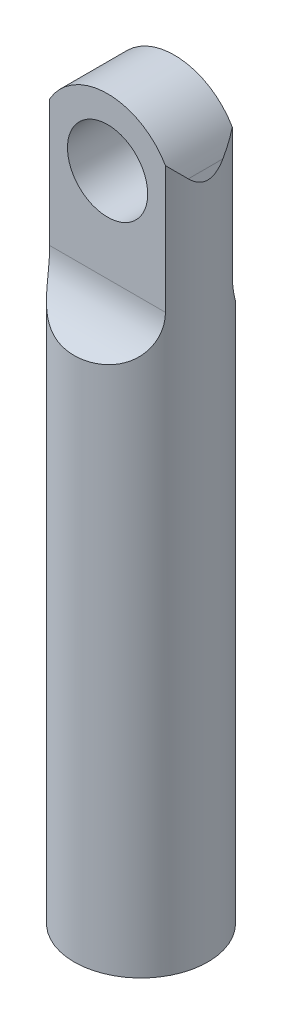
ISO-10303-21;
HEADER;
FILE_DESCRIPTION(('STEP AP214'),'2;1');
FILE_NAME('part.step','',(''),(''),'','','');
FILE_SCHEMA(('AUTOMOTIVE_DESIGN { 1 0 10303 214 1 1 1 1 }'));
ENDSEC;
DATA;
#1=APPLICATION_CONTEXT('core data for automotive mechanical design processes');
#2=APPLICATION_PROTOCOL_DEFINITION('international standard','automotive_design',2000,#1);
#3=PRODUCT_CONTEXT('',#1,'mechanical');
#4=PRODUCT('Part','Part','',(#3));
#5=PRODUCT_RELATED_PRODUCT_CATEGORY('part','',(#4));
#6=PRODUCT_DEFINITION_FORMATION('','',#4);
#7=PRODUCT_DEFINITION_CONTEXT('part definition',#1,'design');
#8=PRODUCT_DEFINITION('design','',#6,#7);
#9=PRODUCT_DEFINITION_SHAPE('','',#8);
#10=(LENGTH_UNIT() NAMED_UNIT(*) SI_UNIT(.MILLI.,.METRE.));
#11=(NAMED_UNIT(*) PLANE_ANGLE_UNIT() SI_UNIT($,.RADIAN.));
#12=(NAMED_UNIT(*) SI_UNIT($,.STERADIAN.) SOLID_ANGLE_UNIT());
#13=UNCERTAINTY_MEASURE_WITH_UNIT(LENGTH_MEASURE(1.E-05),#10,'distance_accuracy_value','');
#14=(GEOMETRIC_REPRESENTATION_CONTEXT(3) GLOBAL_UNCERTAINTY_ASSIGNED_CONTEXT((#13)) GLOBAL_UNIT_ASSIGNED_CONTEXT((#10,
#11,#12)) REPRESENTATION_CONTEXT('',''));
#15=CARTESIAN_POINT('',(0.,0.,0.));
#16=DIRECTION('',(0.,0.,1.));
#17=DIRECTION('',(1.,0.,0.));
#18=AXIS2_PLACEMENT_3D('',#15,#16,#17);
#19=CARTESIAN_POINT('',(-5.,55.,-2.5));
#20=DIRECTION('',(0.,0.,1.));
#21=DIRECTION('',(0.,-1.,0.));
#22=AXIS2_PLACEMENT_3D('',#19,#20,#21);
#23=PLANE('',#22);
#24=CARTESIAN_POINT('',(0.,50.,-2.5));
#25=DIRECTION('',(0.,0.,1.));
#26=DIRECTION('',(0.,-1.,0.));
#27=AXIS2_PLACEMENT_3D('',#24,#25,#26);
#28=CIRCLE('',#27,3.);
#29=CARTESIAN_POINT('',(0.,47.,-2.5));
#30=VERTEX_POINT('',#29);
#31=EDGE_CURVE('E170',#30,#30,#28,.T.);
#32=ORIENTED_EDGE('',*,*,#31,.T.);
#33=EDGE_LOOP('',(#32));
#34=FACE_BOUND('',#33,.T.);
#35=DIRECTION('',(0.,-1.,0.));
#36=VECTOR('',#35,1.);
#37=CARTESIAN_POINT('',(-4.33012701892219,55.,-2.5));
#38=LINE('',#37,#36);
#39=CARTESIAN_POINT('',(-4.33012701892219,52.5,-2.50000000000001));
#40=VERTEX_POINT('',#39);
#41=CARTESIAN_POINT('',(-4.33012701892219,43.,-2.5));
#42=VERTEX_POINT('',#41);
#43=EDGE_CURVE('E182',#40,#42,#38,.T.);
#44=ORIENTED_EDGE('',*,*,#43,.F.);
#45=CARTESIAN_POINT('',(0.,50.,-2.50000000000001));
#46=DIRECTION('',(0.,0.,1.));
#47=DIRECTION('',(0.,1.,0.));
#48=AXIS2_PLACEMENT_3D('',#45,#46,#47);
#49=CIRCLE('',#48,5.);
#50=CARTESIAN_POINT('',(4.33012701892219,52.5,-2.50000000000001));
#51=VERTEX_POINT('',#50);
#52=EDGE_CURVE('E148',#51,#40,#49,.T.);
#53=ORIENTED_EDGE('',*,*,#52,.F.);
#54=DIRECTION('',(0.,-1.,0.));
#55=VECTOR('',#54,1.);
#56=CARTESIAN_POINT('',(4.33012701892219,55.,-2.5));
#57=LINE('',#56,#55);
#58=CARTESIAN_POINT('',(4.33012701892219,43.,-2.5));
#59=VERTEX_POINT('',#58);
#60=EDGE_CURVE('E177',#59,#51,#57,.F.);
#61=ORIENTED_EDGE('',*,*,#60,.F.);
#62=DIRECTION('',(1.,0.,0.));
#63=VECTOR('',#62,1.);
#64=CARTESIAN_POINT('',(-5.,43.,-2.5));
#65=LINE('',#64,#63);
#66=EDGE_CURVE('E173',#42,#59,#65,.T.);
#67=ORIENTED_EDGE('',*,*,#66,.F.);
#68=EDGE_LOOP('',(#44,#53,#61,#67));
#69=FACE_BOUND('',#68,.T.);
#70=ADVANCED_FACE('F33',(#34,#69),#23,.F.);
#71=CARTESIAN_POINT('',(-5.,55.,2.5));
#72=DIRECTION('',(0.,0.,-1.));
#73=DIRECTION('',(0.,1.,0.));
#74=AXIS2_PLACEMENT_3D('',#71,#72,#73);
#75=PLANE('',#74);
#76=CARTESIAN_POINT('',(0.,50.,2.5));
#77=DIRECTION('',(0.,0.,1.));
#78=DIRECTION('',(1.,0.,0.));
#79=AXIS2_PLACEMENT_3D('',#76,#77,#78);
#80=CIRCLE('',#79,3.);
#81=CARTESIAN_POINT('',(3.,50.,2.5));
#82=VERTEX_POINT('',#81);
#83=EDGE_CURVE('E167',#82,#82,#80,.T.);
#84=ORIENTED_EDGE('',*,*,#83,.F.);
#85=EDGE_LOOP('',(#84));
#86=FACE_BOUND('',#85,.T.);
#87=CARTESIAN_POINT('',(0.,50.,2.5));
#88=DIRECTION('',(0.,0.,-1.));
#89=DIRECTION('',(0.,1.,0.));
#90=AXIS2_PLACEMENT_3D('',#87,#88,#89);
#91=CIRCLE('',#90,5.);
#92=CARTESIAN_POINT('',(4.33012701892219,52.5,2.5));
#93=VERTEX_POINT('',#92);
#94=CARTESIAN_POINT('',(-4.33012701892219,52.5,2.5));
#95=VERTEX_POINT('',#94);
#96=EDGE_CURVE('E238',#93,#95,#91,.F.);
#97=ORIENTED_EDGE('',*,*,#96,.T.);
#98=DIRECTION('',(0.,-1.,0.));
#99=VECTOR('',#98,1.);
#100=CARTESIAN_POINT('',(-4.33012701892219,55.,2.5));
#101=LINE('',#100,#99);
#102=CARTESIAN_POINT('',(-4.33012701892219,43.,2.5));
#103=VERTEX_POINT('',#102);
#104=EDGE_CURVE('E184',#103,#95,#101,.F.);
#105=ORIENTED_EDGE('',*,*,#104,.F.);
#106=DIRECTION('',(1.,0.,0.));
#107=VECTOR('',#106,1.);
#108=CARTESIAN_POINT('',(-5.,43.,2.5));
#109=LINE('',#108,#107);
#110=CARTESIAN_POINT('',(4.33012701892219,43.,2.5));
#111=VERTEX_POINT('',#110);
#112=EDGE_CURVE('E174',#103,#111,#109,.T.);
#113=ORIENTED_EDGE('',*,*,#112,.T.);
#114=DIRECTION('',(0.,-1.,0.));
#115=VECTOR('',#114,1.);
#116=CARTESIAN_POINT('',(4.33012701892219,55.,2.5));
#117=LINE('',#116,#115);
#118=EDGE_CURVE('E57',#93,#111,#117,.T.);
#119=ORIENTED_EDGE('',*,*,#118,.F.);
#120=EDGE_LOOP('',(#97,#105,#113,#119));
#121=FACE_BOUND('',#120,.T.);
#122=ADVANCED_FACE('F214',(#86,#121),#75,.F.);
#123=CARTESIAN_POINT('',(0.,55.,0.));
#124=DIRECTION('',(0.,-1.,0.));
#125=DIRECTION('',(0.,0.,-1.));
#126=AXIS2_PLACEMENT_3D('',#123,#124,#125);
#127=CYLINDRICAL_SURFACE('',#126,5.);
#128=ORIENTED_EDGE('',*,*,#60,.T.);
#129=CARTESIAN_POINT('',(0.,50.,0.));
#130=DIRECTION('',(0.,-0.707106781186547,-0.707106781186547));
#131=DIRECTION('',(0.,-0.707106781186548,0.707106781186547));
#132=AXIS2_PLACEMENT_3D('',#129,#130,#131);
#133=ELLIPSE('',#132,7.07106781186547,5.);
#134=CARTESIAN_POINT('',(4.82962913144534,51.2940952255126,-1.29409522551259));
#135=VERTEX_POINT('',#134);
#136=EDGE_CURVE('E163',#51,#135,#133,.T.);
#137=ORIENTED_EDGE('',*,*,#136,.T.);
#138=CARTESIAN_POINT('',(0.,69.3185165257816,0.));
#139=DIRECTION('',(-0.965925826289069,-0.258819045102518,0.));
#140=DIRECTION('',(0.258819045102518,-0.965925826289069,0.));
#141=AXIS2_PLACEMENT_3D('',#138,#139,#140);
#142=ELLIPSE('',#141,19.3185165257816,5.);
#143=CARTESIAN_POINT('',(4.82962913144534,51.2940952255126,1.29409522551259));
#144=VERTEX_POINT('',#143);
#145=EDGE_CURVE('E11',#135,#144,#142,.T.);
#146=ORIENTED_EDGE('',*,*,#145,.T.);
#147=CARTESIAN_POINT('',(0.,50.,0.));
#148=DIRECTION('',(0.,-0.707106781186548,0.707106781186547));
#149=DIRECTION('',(0.,-0.707106781186547,-0.707106781186547));
#150=AXIS2_PLACEMENT_3D('',#147,#148,#149);
#151=ELLIPSE('',#150,7.07106781186547,5.);
#152=EDGE_CURVE('E162',#144,#93,#151,.T.);
#153=ORIENTED_EDGE('',*,*,#152,.T.);
#154=ORIENTED_EDGE('',*,*,#118,.T.);
#155=CARTESIAN_POINT('',(-4.3301270189222,43.,2.5));
#156=CARTESIAN_POINT('',(-4.33013125679978,43.1905226271513,2.50000889668931));
#157=CARTESIAN_POINT('',(-4.32231218190183,43.3813019501048,2.51368905043741));
#158=CARTESIAN_POINT('',(-4.29035552129286,43.7579282107858,2.56784171436945));
#159=CARTESIAN_POINT('',(-4.26618265008494,43.9437635783007,2.60837215368715));
#160=CARTESIAN_POINT('',(-4.19964343220084,44.3050410770251,2.71420135223375));
#161=CARTESIAN_POINT('',(-4.15726516830901,44.4804763145765,2.77951633210224));
#162=CARTESIAN_POINT('',(-4.05192963863783,44.8153255023282,2.930923294209));
#163=CARTESIAN_POINT('',(-3.98899160016127,44.9747542402332,3.01699584455803));
#164=CARTESIAN_POINT('',(-3.84218264491327,45.269597549526,3.20174364079884));
#165=CARTESIAN_POINT('',(-3.75883386194212,45.4054852580552,3.30007835632826));
#166=CARTESIAN_POINT('',(-3.56986456296856,45.6547247963213,3.503610305284));
#167=CARTESIAN_POINT('',(-3.46424532287115,45.7680779163731,3.60880714533146));
#168=CARTESIAN_POINT('',(-3.23380035976276,45.9698274288287,3.81656767279417));
#169=CARTESIAN_POINT('',(-3.10931468546988,46.0585994858212,3.919146368549));
#170=CARTESIAN_POINT('',(-2.84244770470506,46.2150141013485,4.11680562653878));
#171=CARTESIAN_POINT('',(-2.70005908248791,46.2826479825072,4.21188309752474));
#172=CARTESIAN_POINT('',(-2.38803291830957,46.4044665487591,4.39692271237488));
#173=CARTESIAN_POINT('',(-2.21710908482539,46.4570283297836,4.48577073278043));
#174=CARTESIAN_POINT('',(-1.86231870340965,46.544662918304,4.64430423718748));
#175=CARTESIAN_POINT('',(-1.67844478172529,46.5797256685033,4.71397869118395));
#176=CARTESIAN_POINT('',(-1.38149948537681,46.6241085913383,4.80671372269456));
#177=CARTESIAN_POINT('',(-1.27129111057916,46.6380481687414,4.83703793145631));
#178=CARTESIAN_POINT('',(-1.04861226156817,46.6618597188544,4.89014297264526));
#179=CARTESIAN_POINT('',(-0.936141591680433,46.6717313381108,4.91292314955895));
#180=CARTESIAN_POINT('',(-0.709603058403687,46.6878398078798,4.95072346599626));
#181=CARTESIAN_POINT('',(-0.595534504081868,46.694075032993,4.96574013503879));
#182=CARTESIAN_POINT('',(-0.366498879750096,46.7031914037264,4.98787688433706));
#183=CARTESIAN_POINT('',(-0.251531773903659,46.7060724148778,4.9949966480093));
#184=CARTESIAN_POINT('',(-0.00889287944083746,46.7087563808652,5.00161945133241));
#185=CARTESIAN_POINT('',(0.118808753399831,46.7081929097497,5.00021587067192));
#186=CARTESIAN_POINT('',(0.37365947307309,46.7030857330948,4.98765052041487));
#187=CARTESIAN_POINT('',(0.500808514497078,46.698541706448,4.97648796357169));
#188=CARTESIAN_POINT('',(0.75374883471278,46.6852046904141,4.94450421776604));
#189=CARTESIAN_POINT('',(0.879539184533255,46.6764089614521,4.9236768016198));
#190=CARTESIAN_POINT('',(1.12876272186229,46.6540790452287,4.87258388564565));
#191=CARTESIAN_POINT('',(1.2521959677909,46.6405449755667,4.84231862005481));
#192=CARTESIAN_POINT('',(1.49715811539403,46.6078514333695,4.77230847574778));
#193=CARTESIAN_POINT('',(1.61864862981211,46.588628875865,4.73245828206544));
#194=CARTESIAN_POINT('',(1.85719992702891,46.5437018306339,4.64402703010784));
#195=CARTESIAN_POINT('',(1.97426033265347,46.5179967924181,4.59544523044944));
#196=CARTESIAN_POINT('',(2.20263223065096,46.4590954950401,4.49045420543554));
#197=CARTESIAN_POINT('',(2.31395265088953,46.425911328902,4.43405767182761));
#198=CARTESIAN_POINT('',(2.52984976834563,46.3509162546266,4.31451810570529));
#199=CARTESIAN_POINT('',(2.63442889647337,46.3091084792629,4.25137752716394));
#200=CARTESIAN_POINT('',(2.81046347581133,46.227510757124,4.13635418942544));
#201=CARTESIAN_POINT('',(2.88365477825846,46.1898380690462,4.0856126546544));
#202=CARTESIAN_POINT('',(3.02513582347969,46.1086891267687,3.98198882456775));
#203=CARTESIAN_POINT('',(3.09342647640506,46.065213954521,3.92910692962914));
#204=CARTESIAN_POINT('',(3.22465834838411,45.9722171553115,3.82213839916748));
#205=CARTESIAN_POINT('',(3.28760294212188,45.9226993915585,3.76805255126626));
#206=CARTESIAN_POINT('',(3.4078662417763,45.8174614548554,3.65964510064113));
#207=CARTESIAN_POINT('',(3.46518478987333,45.7617411080063,3.60532349134834));
#208=CARTESIAN_POINT('',(3.57415478335428,45.6439331364308,3.49733083278611));
#209=CARTESIAN_POINT('',(3.6257869367215,45.5818251398517,3.44366251631649));
#210=CARTESIAN_POINT('',(3.72307422944814,45.4515930193741,3.33824278864935));
#211=CARTESIAN_POINT('',(3.7687295038867,45.383469031497,3.28649133414917));
#212=CARTESIAN_POINT('',(3.85411637526354,45.2415390109071,3.18592866955428));
#213=CARTESIAN_POINT('',(3.89384636589797,45.1677314456083,3.13711825888599));
#214=CARTESIAN_POINT('',(3.9675247542087,45.014936470152,3.04340308753559));
#215=CARTESIAN_POINT('',(4.00147330711088,44.9359491991433,2.99849822200931));
#216=CARTESIAN_POINT('',(4.0621171581764,44.7778586452223,2.91576564463246));
#217=CARTESIAN_POINT('',(4.08910890362037,44.6990012121079,2.87768439746375));
#218=CARTESIAN_POINT('',(4.13841064862455,44.5376991102232,2.80632141007552));
#219=CARTESIAN_POINT('',(4.16071911462981,44.4552532770563,2.77304124309763));
#220=CARTESIAN_POINT('',(4.20090232461214,44.2873949993762,2.71178208324322));
#221=CARTESIAN_POINT('',(4.21877824364839,44.201983347955,2.68380168587399));
#222=CARTESIAN_POINT('',(4.2503635660562,44.0287249748713,2.63349433830008));
#223=CARTESIAN_POINT('',(4.26407138772685,43.9408773425722,2.61116953480324));
#224=CARTESIAN_POINT('',(4.28785391449897,43.7609315905126,2.57193513930205));
#225=CARTESIAN_POINT('',(4.29781882988571,43.6687829536011,2.55519061052295));
#226=CARTESIAN_POINT('',(4.31376254878034,43.4831691911607,2.52818092416947));
#227=CARTESIAN_POINT('',(4.31973996325206,43.3897036184456,2.51791802452098));
#228=CARTESIAN_POINT('',(4.32782125338374,43.2021128202313,2.50400242566826));
#229=CARTESIAN_POINT('',(4.3299250173379,43.1079875757876,2.50034991709023));
#230=CARTESIAN_POINT('',(4.33030134580847,42.9197060784692,2.49969801670809));
#231=CARTESIAN_POINT('',(4.32857386340405,42.8255498252289,2.50269870638494));
#232=CARTESIAN_POINT('',(4.32113793137568,42.6348915866358,2.51551670988404));
#233=CARTESIAN_POINT('',(4.3153065609408,42.5384084319939,2.52554445958824));
#234=CARTESIAN_POINT('',(4.29941184235028,42.3467988300761,2.55250898968232));
#235=CARTESIAN_POINT('',(4.2893499548879,42.2516719262301,2.56944338531716));
#236=CARTESIAN_POINT('',(4.2647901285053,42.0634021836922,2.61000517959523));
#237=CARTESIAN_POINT('',(4.25029067331412,41.9702600348243,2.63363486574485));
#238=CARTESIAN_POINT('',(4.21660102369679,41.7867311299357,2.6872433506622));
#239=CARTESIAN_POINT('',(4.19741278322432,41.6963432437353,2.71721950397852));
#240=CARTESIAN_POINT('',(4.15422519179493,41.5197393661866,2.78279352066214));
#241=CARTESIAN_POINT('',(4.13026848589584,41.4334942579008,2.81834099893247));
#242=CARTESIAN_POINT('',(4.07714655178755,41.2650527323017,2.89465632328248));
#243=CARTESIAN_POINT('',(4.04798343411918,41.1828546915765,2.93542205213424));
#244=CARTESIAN_POINT('',(3.98416586974965,41.0231174030555,3.02147122893222));
#245=CARTESIAN_POINT('',(3.94951305063221,40.9455767837976,3.06675333639563));
#246=CARTESIAN_POINT('',(3.87448465135114,40.795686732367,3.16101190974961));
#247=CARTESIAN_POINT('',(3.83410929677942,40.7233370957264,3.20998822997255));
#248=CARTESIAN_POINT('',(3.74920414776581,40.5870277975367,3.30870524950928));
#249=CARTESIAN_POINT('',(3.70490136873056,40.5228496448586,3.35833939140396));
#250=CARTESIAN_POINT('',(3.61087340018463,40.3999738284698,3.45924372464734));
#251=CARTESIAN_POINT('',(3.56114640288466,40.3412780040882,3.51051445738892));
#252=CARTESIAN_POINT('',(3.40394899376581,40.1737529394778,3.66532846138689));
#253=CARTESIAN_POINT('',(3.28837555044212,40.0733463492848,3.76997796210094));
#254=CARTESIAN_POINT('',(3.03725226688658,39.894578397,3.97511296174378));
#255=CARTESIAN_POINT('',(2.90161930294947,39.8163129163989,4.07557879050274));
#256=CARTESIAN_POINT('',(2.61378023544201,39.679977699662,4.26590596677243));
#257=CARTESIAN_POINT('',(2.46156611815424,39.621917786303,4.35576214249888));
#258=CARTESIAN_POINT('',(2.1263481148819,39.5172727163268,4.52970041342736));
#259=CARTESIAN_POINT('',(1.94180495672614,39.4726996110253,4.61201016339496));
#260=CARTESIAN_POINT('',(1.56116268723402,39.4001086990112,4.75437749286267));
#261=CARTESIAN_POINT('',(1.36505685124071,39.3721006327944,4.81442197231922));
#262=CARTESIAN_POINT('',(1.05022939800143,39.33824538272,4.88989889067439));
#263=CARTESIAN_POINT('',(0.933830893933088,39.3280350430473,4.91346078070324));
#264=CARTESIAN_POINT('',(0.699353560380378,39.3115045761599,4.95227327892622));
#265=CARTESIAN_POINT('',(0.581274582233373,39.3051847953385,4.96752314705095));
#266=CARTESIAN_POINT('',(0.344144654022778,39.2961203273543,4.98956474282594));
#267=CARTESIAN_POINT('',(0.225093272421559,39.2933773251863,4.99635248396244));
#268=CARTESIAN_POINT('',(-0.0132209476336897,39.291332627527,5.00140276999181));
#269=CARTESIAN_POINT('',(-0.13248379035598,39.2920310023077,4.99966514079926));
#270=CARTESIAN_POINT('',(-0.3804690966111,39.2971074326417,4.98717511016003));
#271=CARTESIAN_POINT('',(-0.509148827362212,39.3017882400987,4.97568118980376));
#272=CARTESIAN_POINT('',(-0.765015606491994,39.3155079796231,4.94281189108322));
#273=CARTESIAN_POINT('',(-0.892202548182689,39.3245472212635,4.92143581080856));
#274=CARTESIAN_POINT('',(-1.1441863708832,39.3475023625064,4.86902486126695));
#275=CARTESIAN_POINT('',(-1.26898221878808,39.3614203220543,4.83798591265895));
#276=CARTESIAN_POINT('',(-1.51512891855146,39.3948655342184,4.76663407853611));
#277=CARTESIAN_POINT('',(-1.63647990993711,39.4143925592932,4.72632156923246));
#278=CARTESIAN_POINT('',(-1.87289391866985,39.4596388651975,4.63766791427719));
#279=CARTESIAN_POINT('',(-1.98802397799306,39.4852608011445,4.58945636043741));
#280=CARTESIAN_POINT('',(-2.21284754938686,39.5438640355537,4.48538129157427));
#281=CARTESIAN_POINT('',(-2.32254095011672,39.5768454846599,4.42951761992651));
#282=CARTESIAN_POINT('',(-2.53520521218746,39.651185447394,4.31132343003055));
#283=CARTESIAN_POINT('',(-2.63818566244583,39.692531649838,4.2490024805687));
#284=CARTESIAN_POINT('',(-2.83645644430416,39.7846413936696,4.11928849237987));
#285=CARTESIAN_POINT('',(-2.93174853382356,39.8354027735,4.05189661995288));
#286=CARTESIAN_POINT('',(-3.10167979143771,39.9398214157041,3.92293648787922));
#287=CARTESIAN_POINT('',(-3.17738886029114,39.9922269852026,3.86176273567874));
#288=CARTESIAN_POINT('',(-3.32165375356506,40.1050840284797,3.73839812474917));
#289=CARTESIAN_POINT('',(-3.39021019640879,40.1655348056315,3.6762073544912));
#290=CARTESIAN_POINT('',(-3.51970794469441,40.2944976752685,3.55241846798407));
#291=CARTESIAN_POINT('',(-3.58065575042513,40.3630027881621,3.49081988792081));
#292=CARTESIAN_POINT('',(-3.69480549598859,40.5079020989853,3.36976781709535));
#293=CARTESIAN_POINT('',(-3.74800840435763,40.5842953084249,3.31031405881362));
#294=CARTESIAN_POINT('',(-3.83941424235972,40.7326540597575,3.20360494667497));
#295=CARTESIAN_POINT('',(-3.87867216344891,40.8036104020898,3.15584389295477));
#296=CARTESIAN_POINT('',(-3.95172011486561,40.950468424364,3.06387931413043));
#297=CARTESIAN_POINT('',(-3.98551035424579,41.0263699150763,3.01967565304459));
#298=CARTESIAN_POINT('',(-4.04785658628095,41.182652254602,2.93557544494802));
#299=CARTESIAN_POINT('',(-4.07640927457935,41.2630358897776,2.89568162348187));
#300=CARTESIAN_POINT('',(-4.12851562174687,41.4276300566745,2.8208914274824));
#301=CARTESIAN_POINT('',(-4.15206929587425,41.5118405767142,2.78599503769578));
#302=CARTESIAN_POINT('',(-4.21485710633363,41.7660275171235,2.69086323986713));
#303=CARTESIAN_POINT('',(-4.2474272404665,41.9407046236665,2.63847724331116));
#304=CARTESIAN_POINT('',(-4.29640365074313,42.2973649830942,2.55795938316638));
#305=CARTESIAN_POINT('',(-4.31284212946155,42.479332922412,2.52977921314863));
#306=CARTESIAN_POINT('',(-4.3246227498195,42.7186031086978,2.50951139813247));
#307=CARTESIAN_POINT('',(-4.32668861125968,42.774797783093,2.50594772991986));
#308=CARTESIAN_POINT('',(-4.32944013091331,42.8873208182519,2.50119069486866));
#309=CARTESIAN_POINT('',(-4.33012576548645,42.9436491812887,2.49999736862894));
#310=CARTESIAN_POINT('',(-4.3301270189222,43.,2.5));
#311=B_SPLINE_CURVE_WITH_KNOTS('',3,(#155,#156,#157,#158,#159,#160,#161,#162,#163,#164,#165,
#166,#167,#168,#169,#170,#171,#172,#173,#174,#175,#176,#177,#178,#179,#180,#181,#182,#183,#184,
#185,#186,#187,#188,#189,#190,#191,#192,#193,#194,#195,#196,#197,#198,#199,#200,#201,#202,#203,
#204,#205,#206,#207,#208,#209,#210,#211,#212,#213,#214,#215,#216,#217,#218,#219,#220,#221,#222,
#223,#224,#225,#226,#227,#228,#229,#230,#231,#232,#233,#234,#235,#236,#237,#238,#239,#240,#241,
#242,#243,#244,#245,#246,#247,#248,#249,#250,#251,#252,#253,#254,#255,#256,#257,#258,#259,#260,
#261,#262,#263,#264,#265,#266,#267,#268,#269,#270,#271,#272,#273,#274,#275,#276,#277,#278,#279,
#280,#281,#282,#283,#284,#285,#286,#287,#288,#289,#290,#291,#292,#293,#294,#295,#296,#297,#298,
#299,#300,#301,#302,#303,#304,#305,#306,#307,#308,#309,#310),.UNSPECIFIED.,.T.,.F.,(4,2,2,2,2,2,
2,2,2,2,2,2,2,2,2,2,2,2,2,2,2,2,2,2,2,2,2,2,2,2,2,2,2,2,2,2,2,2,2,2,2,2,2,2,2,2,2,2,2,2,2,2,2,2,
2,2,2,2,2,2,2,2,2,2,2,2,2,2,2,2,2,2,2,2,2,2,2,4),(0.,0.571361684173008,1.14396010573025,
1.71693392164288,2.28937342468162,2.84846958739709,3.40753372742665,3.95751175921496,
4.50771526536925,5.10448887469104,5.70160507654313,6.04676179728888,6.39194850141363,
6.73728937944535,7.0826441015418,7.46533369319913,7.84805415888253,8.23102155902922,
8.61397945510208,9.00135453548044,9.38876252265144,9.77554854620957,10.1621943053366,
10.4520000842089,10.7417519001495,11.031319430222,11.3208950808088,11.6114247204961,
11.9019477929981,12.1925494817106,12.483143366825,12.7577370178698,13.0324204457206,
13.307030977515,13.5817455882609,13.8639843112501,14.1463213001389,14.4286664307501,
14.7110150192286,15.0022017698748,15.29328806337,15.5844739292925,15.8755386558917,
16.1641086994183,16.4525620288504,16.7409299972951,17.0292866009533,17.3062562842129,
17.5833185599054,18.1368663449966,18.6927757890643,19.2489551078339,19.8673941306052,
20.4861964443429,20.8434719372495,21.2007792353528,21.5582547976364,21.9157376594911,
22.3031072428886,22.6905043446145,23.0780652147797,23.4656103650894,23.8473384808189,
24.2290744109697,24.6102525396404,24.9913432646759,25.3224824927032,25.6535930663316,
25.984418797641,26.315203122011,26.5971921781607,26.8791704501237,27.1613260140971,
27.4434807168486,27.9966011329231,28.5486151308744,28.7176037057161,28.8865951749438),.UNSPECIFIED.);
#312=EDGE_CURVE('E197',#111,#103,#311,.T.);
#313=ORIENTED_EDGE('',*,*,#312,.T.);
#314=ORIENTED_EDGE('',*,*,#104,.T.);
#315=CARTESIAN_POINT('',(-4.82962913144534,51.2940952255126,1.29409522551261));
#316=VERTEX_POINT('',#315);
#317=EDGE_CURVE('E157',#95,#316,#151,.T.);
#318=ORIENTED_EDGE('',*,*,#317,.T.);
#319=CARTESIAN_POINT('',(0.,69.3185165257816,0.));
#320=DIRECTION('',(0.965925826289069,-0.258819045102518,0.));
#321=DIRECTION('',(-0.258819045102518,-0.965925826289069,0.));
#322=AXIS2_PLACEMENT_3D('',#319,#320,#321);
#323=ELLIPSE('',#322,19.3185165257816,5.);
#324=CARTESIAN_POINT('',(-4.82962913144534,51.2940952255126,-1.2940952255126));
#325=VERTEX_POINT('',#324);
#326=EDGE_CURVE('E42',#316,#325,#323,.T.);
#327=ORIENTED_EDGE('',*,*,#326,.T.);
#328=EDGE_CURVE('E166',#325,#40,#133,.T.);
#329=ORIENTED_EDGE('',*,*,#328,.T.);
#330=ORIENTED_EDGE('',*,*,#43,.T.);
#331=CARTESIAN_POINT('',(0.,46.7080992435478,-5.));
#332=CARTESIAN_POINT('',(-0.125776618095075,46.7081003311831,-4.99999922268485));
#333=CARTESIAN_POINT('',(-0.251577278863649,46.7061883994661,-4.99524911281027));
#334=CARTESIAN_POINT('',(-0.502392268468498,46.698432165854,-4.97628687367421));
#335=CARTESIAN_POINT('',(-0.627406182961247,46.6925859425866,-4.96207012126663));
#336=CARTESIAN_POINT('',(-0.876050499718579,46.6766127771026,-4.92426479553938));
#337=CARTESIAN_POINT('',(-0.999676822813338,46.6664755120535,-4.90065363063706));
#338=CARTESIAN_POINT('',(-1.24432464059258,46.6413822740346,-4.84431724837669));
#339=CARTESIAN_POINT('',(-1.36534648483111,46.6264269520663,-4.81159326239687));
#340=CARTESIAN_POINT('',(-1.60436256340029,46.5908903662989,-4.73727203233434));
#341=CARTESIAN_POINT('',(-1.72234205460581,46.5702858839093,-4.69563832692483));
#342=CARTESIAN_POINT('',(-1.95374554150306,46.5225668373792,-4.60416704658411));
#343=CARTESIAN_POINT('',(-2.06716908538026,46.4954516294198,-4.55432866047899));
#344=CARTESIAN_POINT('',(-2.28814707929429,46.4337526361058,-4.44740568196679));
#345=CARTESIAN_POINT('',(-2.395712950483,46.3991840876929,-4.3903359693468));
#346=CARTESIAN_POINT('',(-2.60408876822719,46.3215002951486,-4.27003254381958));
#347=CARTESIAN_POINT('',(-2.70490105306116,46.278388029766,-4.20680098312181));
#348=CARTESIAN_POINT('',(-2.87532198531556,46.194205388881,-4.09150586341491));
#349=CARTESIAN_POINT('',(-2.94659572574795,46.1551466037866,-4.04042304097925));
#350=CARTESIAN_POINT('',(-3.08421153652581,46.0712068904032,-3.93637855891857));
#351=CARTESIAN_POINT('',(-3.15055283631667,46.0263250554209,-3.88341660763383));
#352=CARTESIAN_POINT('',(-3.27786084701894,45.9305473252507,-3.77657670280734));
#353=CARTESIAN_POINT('',(-3.33883082826315,45.8796551342792,-3.72269933079482));
#354=CARTESIAN_POINT('',(-3.45514586258692,45.7717508099158,-3.61500335647816));
#355=CARTESIAN_POINT('',(-3.51049130331789,45.7147390988476,-3.56118475037706));
#356=CARTESIAN_POINT('',(-3.6155429844939,45.5944795724867,-3.45448595124081));
#357=CARTESIAN_POINT('',(-3.66523131517862,45.5312130750898,-3.40160916245962));
#358=CARTESIAN_POINT('',(-3.75869980963647,45.3988508389527,-3.29803610101684));
#359=CARTESIAN_POINT('',(-3.80248211495463,45.3297572279933,-3.24733904254497));
#360=CARTESIAN_POINT('',(-3.88424919715062,45.1860708499939,-3.14907884080223));
#361=CARTESIAN_POINT('',(-3.92223134973662,45.1114756162353,-3.10151712162089));
#362=CARTESIAN_POINT('',(-3.99255258021795,44.9573157368992,-3.01045435602629));
#363=CARTESIAN_POINT('',(-4.0248917775803,44.8777511965754,-2.96695322365542));
#364=CARTESIAN_POINT('',(-4.08275293836849,44.7181883176873,-2.8867723428955));
#365=CARTESIAN_POINT('',(-4.10852846707935,44.6383959687396,-2.84986479186416));
#366=CARTESIAN_POINT('',(-4.15546622582572,44.475367602227,-2.78097810403371));
#367=CARTESIAN_POINT('',(-4.17662691337239,44.3921304442773,-2.74900061612832));
#368=CARTESIAN_POINT('',(-4.2145828921518,44.2228376773095,-2.69044770246574));
#369=CARTESIAN_POINT('',(-4.23137932596189,44.1367828126338,-2.66387086319715));
#370=CARTESIAN_POINT('',(-4.26086649939965,43.9623869547356,-2.616447388863));
#371=CARTESIAN_POINT('',(-4.27355568238966,43.8740451084198,-2.5956029268029));
#372=CARTESIAN_POINT('',(-4.29535519650209,43.6929870096852,-2.55937203035692));
#373=CARTESIAN_POINT('',(-4.3043453979421,43.6002193276907,-2.54417017415547));
#374=CARTESIAN_POINT('',(-4.31835446627907,43.4135175137279,-2.52031865025537));
#375=CARTESIAN_POINT('',(-4.32337194490402,43.3195829856404,-2.51167127307107));
#376=CARTESIAN_POINT('',(-4.32953100615615,43.1312082762465,-2.50103962246241));
#377=CARTESIAN_POINT('',(-4.33067246590522,43.0367680790042,-2.49905556027949));
#378=CARTESIAN_POINT('',(-4.32910248258626,42.8480157829908,-2.50177415515036));
#379=CARTESIAN_POINT('',(-4.32639100275325,42.7537036854506,-2.50647687600986));
#380=CARTESIAN_POINT('',(-4.31692280560257,42.5630766953611,-2.52275035307079));
#381=CARTESIAN_POINT('',(-4.31004958732468,42.4667843624955,-2.5345188199264));
#382=CARTESIAN_POINT('',(-4.2920220988697,42.2757312655496,-2.56492847437493));
#383=CARTESIAN_POINT('',(-4.28086932442987,42.1809699784024,-2.58356726064964));
#384=CARTESIAN_POINT('',(-4.25406065479423,41.9936121208552,-2.62747584565565));
#385=CARTESIAN_POINT('',(-4.23840336821332,41.901016228888,-2.65274769304129));
#386=CARTESIAN_POINT('',(-4.20231857429979,41.7187589786654,-2.70954781282417));
#387=CARTESIAN_POINT('',(-4.18189307275982,41.6290964045157,-2.7410734536713));
#388=CARTESIAN_POINT('',(-4.13621775206458,41.4543526773135,-2.8095150337788));
#389=CARTESIAN_POINT('',(-4.11102496894824,41.3692312452398,-2.84636613746437));
#390=CARTESIAN_POINT('',(-4.05537761744166,41.2031810317469,-2.92510410863739));
#391=CARTESIAN_POINT('',(-4.02492518711191,41.1222505639983,-2.96698892780992));
#392=CARTESIAN_POINT('',(-3.95848831511313,40.9651748302377,-3.05506295291939));
#393=CARTESIAN_POINT('',(-3.92250550884271,40.889028158947,-3.10125088478918));
#394=CARTESIAN_POINT('',(-3.84479699589109,40.7420276332618,-3.19708316491825));
#395=CARTESIAN_POINT('',(-3.80307150556579,40.6711735796228,-3.24672738292698));
#396=CARTESIAN_POINT('',(-3.71553174763196,40.5378721704889,-3.34649738995944));
#397=CARTESIAN_POINT('',(-3.66994483939422,40.4752030158758,-3.39652625180212));
#398=CARTESIAN_POINT('',(-3.57338322030477,40.3553743551443,-3.49797870747047));
#399=CARTESIAN_POINT('',(-3.52240671412168,40.2982166971629,-3.54940276178197));
#400=CARTESIAN_POINT('',(-3.36155195301863,40.135289527719,-3.70432179814187));
#401=CARTESIAN_POINT('',(-3.24366379565982,40.0379365353521,-3.8085635402444));
#402=CARTESIAN_POINT('',(-2.98756929836213,39.86448930397,-4.01267277334627));
#403=CARTESIAN_POINT('',(-2.84916900551544,39.7886207003924,-4.11248517406265));
#404=CARTESIAN_POINT('',(-2.55611125479379,39.6568528475332,-4.30077491554747));
#405=CARTESIAN_POINT('',(-2.40144575880964,39.600963532415,-4.38924660346771));
#406=CARTESIAN_POINT('',(-2.06047727473583,39.5002871816484,-4.56014970980844));
#407=CARTESIAN_POINT('',(-1.87259396873237,39.4575851270483,-4.64064014283755));
#408=CARTESIAN_POINT('',(-1.4856286677941,39.3885169025271,-4.778613583755));
#409=CARTESIAN_POINT('',(-1.28654016191106,39.362160339554,-4.83608305422241));
#410=CARTESIAN_POINT('',(-0.967510071761626,39.3308065057542,-4.90696010688348));
#411=CARTESIAN_POINT('',(-0.84975325462347,39.3214906460601,-4.928720799484));
#412=CARTESIAN_POINT('',(-0.61271453330701,39.3067166232645,-4.96376058621475));
#413=CARTESIAN_POINT('',(-0.493432494269963,39.3012588037225,-4.97703892497891));
#414=CARTESIAN_POINT('',(-0.254062751052777,39.2939212956212,-4.99498448392404));
#415=CARTESIAN_POINT('',(-0.133974689889715,39.292043314144,-4.9996475958141));
#416=CARTESIAN_POINT('',(0.106231527077184,39.291773766509,-5.00031391995627));
#417=CARTESIAN_POINT('',(0.226349683527324,39.2933822830536,-4.99631692678413));
#418=CARTESIAN_POINT('',(0.475175918195369,39.3004313488599,-4.97905013421667));
#419=CARTESIAN_POINT('',(0.603828418478689,39.3061591613296,-4.96508583978895));
#420=CARTESIAN_POINT('',(0.859404437608489,39.3220958002762,-4.92728241098539));
#421=CARTESIAN_POINT('',(0.9863278363501,39.3323049364099,-4.9034425942233));
#422=CARTESIAN_POINT('',(1.2375247129807,39.3577821784925,-4.84614610681456));
#423=CARTESIAN_POINT('',(1.36179720467275,39.3730521334113,-4.81268592195962));
#424=CARTESIAN_POINT('',(1.60662366991023,39.4094390476851,-4.73657988813152));
#425=CARTESIAN_POINT('',(1.72717782281954,39.4305557245161,-4.69393448302635));
#426=CARTESIAN_POINT('',(1.96093503331624,39.4790777301096,-4.60110888404368));
#427=CARTESIAN_POINT('',(2.07424065272776,39.5063372914015,-4.55111144293294));
#428=CARTESIAN_POINT('',(2.29519003640136,39.5684113086212,-4.44378018803549));
#429=CARTESIAN_POINT('',(2.40283372164464,39.6032258699529,-4.38644627189815));
#430=CARTESIAN_POINT('',(2.61117467286195,39.6814029138917,-4.26570489769947));
#431=CARTESIAN_POINT('',(2.71188259540436,39.724751869459,-4.20230713158303));
#432=CARTESIAN_POINT('',(2.9054210609745,39.8209939632816,-4.07089657902298));
#433=CARTESIAN_POINT('',(2.99825346570494,39.8738848366173,-4.0028848901496));
#434=CARTESIAN_POINT('',(3.16290622515203,39.9819623569647,-3.87368451377785));
#435=CARTESIAN_POINT('',(3.2358614007036,40.0358362712816,-3.81284146170514));
#436=CARTESIAN_POINT('',(3.37466352694895,40.151474951634,-3.69055511500516));
#437=CARTESIAN_POINT('',(3.44051170926108,40.2132383463848,-3.62911192639865));
#438=CARTESIAN_POINT('',(3.56472770344833,40.3446211394483,-3.5071770789443));
#439=CARTESIAN_POINT('',(3.62309985065224,40.4142359403013,-3.44668488663617));
#440=CARTESIAN_POINT('',(3.73226950308637,40.5610789193087,-3.32816136076849));
#441=CARTESIAN_POINT('',(3.78306783264578,40.6383062673966,-3.27012975989255));
#442=CARTESIAN_POINT('',(3.87048605602793,40.7883752367351,-3.16595749168925));
#443=CARTESIAN_POINT('',(3.90809502083363,40.8602846396096,-3.11929788070688));
#444=CARTESIAN_POINT('',(3.97796367076099,41.0088967600045,-3.02969214336741));
#445=CARTESIAN_POINT('',(4.01022172689621,41.0856009274544,-2.98674714975489));
#446=CARTESIAN_POINT('',(4.06959089459649,41.2432277420542,-2.9053346555767));
#447=CARTESIAN_POINT('',(4.09670331705201,41.3241493080748,-2.86686601559366));
#448=CARTESIAN_POINT('',(4.14607199578154,41.489677942743,-2.7949936741039));
#449=CARTESIAN_POINT('',(4.16832639962596,41.5742864025531,-2.76159190614144));
#450=CARTESIAN_POINT('',(4.20799235132604,41.7454417662853,-2.7007596372298));
#451=CARTESIAN_POINT('',(4.22546228873418,41.8319499505643,-2.67325812014841));
#452=CARTESIAN_POINT('',(4.25619429762062,42.007360608846,-2.62405266487423));
#453=CARTESIAN_POINT('',(4.26945495449684,42.0962638768919,-2.60235067610061));
#454=CARTESIAN_POINT('',(4.29198014375543,42.2758283704817,-2.56503058239201));
#455=CARTESIAN_POINT('',(4.30124493760116,42.366489480598,-2.54941207939969));
#456=CARTESIAN_POINT('',(4.31594747727768,42.5489782121406,-2.5244419672032));
#457=CARTESIAN_POINT('',(4.32138511309715,42.6408058670219,-2.51509053814591));
#458=CARTESIAN_POINT('',(4.32867890009867,42.8286890983139,-2.50251773001221));
#459=CARTESIAN_POINT('',(4.33038442677484,42.9247678941801,-2.49955422890044));
#460=CARTESIAN_POINT('',(4.32980712227236,43.1168458766679,-2.50055400341093));
#461=CARTESIAN_POINT('',(4.32752556000619,43.212845078893,-2.5045150752508));
#462=CARTESIAN_POINT('',(4.31892605970506,43.4041820549342,-2.51931557357515));
#463=CARTESIAN_POINT('',(4.31260599191073,43.4995194529064,-2.53015862934464));
#464=CARTESIAN_POINT('',(4.29580117216144,43.6887755379273,-2.55858641229099));
#465=CARTESIAN_POINT('',(4.28531801240778,43.7826947531307,-2.57616856196864));
#466=CARTESIAN_POINT('',(4.25983494675104,43.9695781756508,-2.61809375167395));
#467=CARTESIAN_POINT('',(4.24478309377185,44.0625179554162,-2.64251428430358));
#468=CARTESIAN_POINT('',(4.20994580582141,44.2455570782599,-2.69766916170981));
#469=CARTESIAN_POINT('',(4.19016218818756,44.3356574968572,-2.72840108182145));
#470=CARTESIAN_POINT('',(4.14555471697846,44.512344001736,-2.79571184944407));
#471=CARTESIAN_POINT('',(4.12073169493729,44.5989306649851,-2.83228973212212));
#472=CARTESIAN_POINT('',(4.06572873204033,44.7679253387821,-2.91069430744452));
#473=CARTESIAN_POINT('',(4.03554900025148,44.8503335122507,-2.95252079522246));
#474=CARTESIAN_POINT('',(3.970538950319,45.0079281279138,-3.03935358879236));
#475=CARTESIAN_POINT('',(3.93587604927672,45.0832573134914,-3.08422620639605));
#476=CARTESIAN_POINT('',(3.86102402745791,45.2289039182152,-3.17743085832985));
#477=CARTESIAN_POINT('',(3.82083303902581,45.2992196313253,-3.22576405915528));
#478=CARTESIAN_POINT('',(3.73483847376319,45.4343503313686,-3.32494796346692));
#479=CARTESIAN_POINT('',(3.68903868577429,45.4991689821134,-3.37579695380572));
#480=CARTESIAN_POINT('',(3.59180487981612,45.6230809021246,-3.47907846368545));
#481=CARTESIAN_POINT('',(3.54036881843708,45.6821720801879,-3.53151155251223));
#482=CARTESIAN_POINT('',(3.38086580614353,45.847313900597,-3.68662267506087));
#483=CARTESIAN_POINT('',(3.26504267264739,45.9452487509832,-3.7901673726696));
#484=CARTESIAN_POINT('',(3.01446654808386,46.1192380913809,-3.99236203414451));
#485=CARTESIAN_POINT('',(2.87970880904038,46.1952870787446,-4.09101076189237));
#486=CARTESIAN_POINT('',(2.58561428011826,46.3318677673969,-4.28337575138156));
#487=CARTESIAN_POINT('',(2.42528238713906,46.391178365816,-4.3764298240096));
#488=CARTESIAN_POINT('',(2.09055975854363,46.4915711264149,-4.545855185363));
#489=CARTESIAN_POINT('',(1.91615499507886,46.5326348280955,-4.62220953941284));
#490=CARTESIAN_POINT('',(1.63360240951392,46.5857915976624,-4.7268932380262));
#491=CARTESIAN_POINT('',(1.528734449836,46.6027845818194,-4.76185460890232));
#492=CARTESIAN_POINT('',(1.31636048949065,46.6325179763206,-4.82487761815574));
#493=CARTESIAN_POINT('',(1.20885499640943,46.6452591981196,-4.85294057283572));
#494=CARTESIAN_POINT('',(0.991984704567688,46.6669728393232,-4.90186873377082));
#495=CARTESIAN_POINT('',(0.882622139957974,46.675949493842,-4.92274202360241));
#496=CARTESIAN_POINT('',(0.662563392604373,46.6905265249215,-4.95715684604588));
#497=CARTESIAN_POINT('',(0.551867729120238,46.6961281753047,-4.97070114463065));
#498=CARTESIAN_POINT('',(0.367552072193286,46.7028260878343,-4.98701473248653));
#499=CARTESIAN_POINT('',(0.294141959796363,46.7048069790797,-4.99188258564844));
#500=CARTESIAN_POINT('',(0.147157305823337,46.7074432265882,-4.99837541693351));
#501=CARTESIAN_POINT('',(0.0735827672989634,46.7080986072514,-5.00000045475066));
#502=CARTESIAN_POINT('',(0.,46.7080992435478,-5.));
#503=B_SPLINE_CURVE_WITH_KNOTS('',3,(#331,#332,#333,#334,#335,#336,#337,#338,#339,#340,#341,
#342,#343,#344,#345,#346,#347,#348,#349,#350,#351,#352,#353,#354,#355,#356,#357,#358,#359,#360,
#361,#362,#363,#364,#365,#366,#367,#368,#369,#370,#371,#372,#373,#374,#375,#376,#377,#378,#379,
#380,#381,#382,#383,#384,#385,#386,#387,#388,#389,#390,#391,#392,#393,#394,#395,#396,#397,#398,
#399,#400,#401,#402,#403,#404,#405,#406,#407,#408,#409,#410,#411,#412,#413,#414,#415,#416,#417,
#418,#419,#420,#421,#422,#423,#424,#425,#426,#427,#428,#429,#430,#431,#432,#433,#434,#435,#436,
#437,#438,#439,#440,#441,#442,#443,#444,#445,#446,#447,#448,#449,#450,#451,#452,#453,#454,#455,
#456,#457,#458,#459,#460,#461,#462,#463,#464,#465,#466,#467,#468,#469,#470,#471,#472,#473,#474,
#475,#476,#477,#478,#479,#480,#481,#482,#483,#484,#485,#486,#487,#488,#489,#490,#491,#492,#493,
#494,#495,#496,#497,#498,#499,#500,#501,#502),.UNSPECIFIED.,.T.,.F.,(4,2,2,2,2,2,2,2,2,2,2,2,2,
2,2,2,2,2,2,2,2,2,2,2,2,2,2,2,2,2,2,2,2,2,2,2,2,2,2,2,2,2,2,2,2,2,2,2,2,2,2,2,2,2,2,2,2,2,2,2,2,
2,2,2,2,2,2,2,2,2,2,2,2,2,2,2,2,2,2,2,2,2,2,2,2,4),(0.,0.377267022494631,0.754718423029593,
1.13308305451033,1.51139658391465,1.89128895089626,2.27121889935868,2.65037939526615,
3.02940792950907,3.3170970118615,3.60483094348704,3.89238845948651,4.17992614314939,
4.46835021190759,4.75666941436084,5.04511868340643,5.33356184495048,5.60809375449937,
5.88271728488217,6.15726884522695,6.43192433841089,6.71490446142088,6.9979834285311,
7.28107136976946,7.56416201226912,7.85556930345503,8.14687483821882,8.43827045025306,
8.72954370427488,9.01753035835127,9.30540021944035,9.59318511715803,9.88095917553218,
10.1573369318153,10.433807044224,10.9862023214156,11.5442003580481,12.1024754595415,
12.726551372326,13.3509937345841,13.7110090649278,14.0710564506976,14.4312754858058,
14.7915030656765,15.1796424337474,15.567808626239,15.9561167918541,16.3444061970146,
16.7243042162383,17.1042075359701,17.4835134864391,17.8627295210303,18.1898687837037,
18.5169512628923,18.8438432008218,19.17069953404,19.4511836566749,19.7317530114886,
20.0122507928349,20.2928553457469,20.5698650635208,20.8469677769184,21.1240523557614,
21.4011448990521,21.6892289960734,21.9772214254803,22.2653658569926,22.5534001917835,
22.8448406958491,23.1361694450724,23.4274501621963,23.7187195134281,24.0012175450285,
24.2838112536504,24.5662151075446,24.8487216867776,25.3969813345735,25.9453787082282,
26.5270416833905,27.1092917981841,27.4445323167892,27.7797088176377,28.1145072289113,
28.4491791984525,28.6698948050187,28.8906063485968),.UNSPECIFIED.);
#504=EDGE_CURVE('E191',#42,#59,#503,.T.);
#505=ORIENTED_EDGE('',*,*,#504,.T.);
#506=EDGE_LOOP('',(#128,#137,#146,#153,#154,#313,#314,#318,#327,#329,#330,#505));
#507=FACE_BOUND('',#506,.T.);
#508=CARTESIAN_POINT('',(0.,0.,0.));
#509=DIRECTION('',(0.,1.,0.));
#510=DIRECTION('',(0.,0.,1.));
#511=AXIS2_PLACEMENT_3D('',#508,#509,#510);
#512=CIRCLE('',#511,5.);
#513=CARTESIAN_POINT('',(0.,0.,5.));
#514=VERTEX_POINT('',#513);
#515=EDGE_CURVE('E188',#514,#514,#512,.T.);
#516=ORIENTED_EDGE('',*,*,#515,.T.);
#517=EDGE_LOOP('',(#516));
#518=FACE_BOUND('',#517,.T.);
#519=ADVANCED_FACE('F35',(#507,#518),#127,.T.);
#520=CARTESIAN_POINT('',(0.,0.,0.));
#521=DIRECTION('',(0.,1.,0.));
#522=DIRECTION('',(0.,0.,1.));
#523=AXIS2_PLACEMENT_3D('',#520,#521,#522);
#524=PLANE('',#523);
#525=DIRECTION('',(0.,0.,-1.));
#526=VECTOR('',#525,1.);
#527=CARTESIAN_POINT('',(-1.5,0.,2.));
#528=LINE('',#527,#526);
#529=CARTESIAN_POINT('',(-1.5,0.,2.));
#530=VERTEX_POINT('',#529);
#531=CARTESIAN_POINT('',(-1.5,0.,-2.));
#532=VERTEX_POINT('',#531);
#533=EDGE_CURVE('E142',#530,#532,#528,.T.);
#534=ORIENTED_EDGE('',*,*,#533,.F.);
#535=CARTESIAN_POINT('',(0.,0.,0.));
#536=DIRECTION('',(0.,-1.,0.));
#537=DIRECTION('',(0.,0.,-1.));
#538=AXIS2_PLACEMENT_3D('',#535,#536,#537);
#539=CIRCLE('',#538,2.5);
#540=CARTESIAN_POINT('',(1.5,0.,2.));
#541=VERTEX_POINT('',#540);
#542=EDGE_CURVE('E49',#541,#530,#539,.T.);
#543=ORIENTED_EDGE('',*,*,#542,.F.);
#544=DIRECTION('',(0.,0.,1.));
#545=VECTOR('',#544,1.);
#546=CARTESIAN_POINT('',(1.5,0.,2.));
#547=LINE('',#546,#545);
#548=CARTESIAN_POINT('',(1.5,0.,-2.));
#549=VERTEX_POINT('',#548);
#550=EDGE_CURVE('E133',#549,#541,#547,.T.);
#551=ORIENTED_EDGE('',*,*,#550,.F.);
#552=CARTESIAN_POINT('',(0.,0.,0.));
#553=DIRECTION('',(0.,-1.,0.));
#554=DIRECTION('',(0.,0.,-1.));
#555=AXIS2_PLACEMENT_3D('',#552,#553,#554);
#556=CIRCLE('',#555,2.5);
#557=EDGE_CURVE('E136',#532,#549,#556,.T.);
#558=ORIENTED_EDGE('',*,*,#557,.F.);
#559=EDGE_LOOP('',(#534,#543,#551,#558));
#560=FACE_BOUND('',#559,.T.);
#561=ORIENTED_EDGE('',*,*,#515,.F.);
#562=EDGE_LOOP('',(#561));
#563=FACE_BOUND('',#562,.T.);
#564=ADVANCED_FACE('F207',(#560,#563),#524,.F.);
#565=CARTESIAN_POINT('',(-5.,43.,-6.5));
#566=DIRECTION('',(1.,0.,0.));
#567=DIRECTION('',(0.,0.,-1.));
#568=AXIS2_PLACEMENT_3D('',#565,#566,#567);
#569=CYLINDRICAL_SURFACE('',#568,4.);
#570=ORIENTED_EDGE('',*,*,#66,.T.);
#571=ORIENTED_EDGE('',*,*,#504,.F.);
#572=EDGE_LOOP('',(#570,#571));
#573=FACE_BOUND('',#572,.T.);
#574=ADVANCED_FACE('F202',(#573),#569,.F.);
#575=CARTESIAN_POINT('',(-5.,43.,6.5));
#576=DIRECTION('',(1.,0.,0.));
#577=DIRECTION('',(0.,0.,-1.));
#578=AXIS2_PLACEMENT_3D('',#575,#576,#577);
#579=CYLINDRICAL_SURFACE('',#578,4.);
#580=ORIENTED_EDGE('',*,*,#112,.F.);
#581=ORIENTED_EDGE('',*,*,#312,.F.);
#582=EDGE_LOOP('',(#580,#581));
#583=FACE_BOUND('',#582,.T.);
#584=ADVANCED_FACE('F206',(#583),#579,.F.);
#585=CARTESIAN_POINT('',(0.,50.,-5.));
#586=DIRECTION('',(0.,0.,1.));
#587=DIRECTION('',(1.,0.,0.));
#588=AXIS2_PLACEMENT_3D('',#585,#586,#587);
#589=CYLINDRICAL_SURFACE('',#588,3.);
#590=ORIENTED_EDGE('',*,*,#83,.T.);
#591=EDGE_LOOP('',(#590));
#592=FACE_BOUND('',#591,.T.);
#593=ORIENTED_EDGE('',*,*,#31,.F.);
#594=EDGE_LOOP('',(#593));
#595=FACE_BOUND('',#594,.T.);
#596=ADVANCED_FACE('F243',(#592,#595),#589,.F.);
#597=CARTESIAN_POINT('',(4.82962913144534,51.2940952255126,5.));
#598=DIRECTION('',(-0.965925826289069,-0.258819045102518,0.));
#599=DIRECTION('',(0.258819045102518,-0.965925826289069,0.));
#600=AXIS2_PLACEMENT_3D('',#597,#598,#599);
#601=PLANE('',#600);
#602=DIRECTION('',(0.,0.,-1.));
#603=VECTOR('',#602,1.);
#604=CARTESIAN_POINT('',(4.82962913144534,51.2940952255126,5.));
#605=LINE('',#604,#603);
#606=EDGE_CURVE('E154',#144,#135,#605,.T.);
#607=ORIENTED_EDGE('',*,*,#606,.F.);
#608=ORIENTED_EDGE('',*,*,#145,.F.);
#609=EDGE_LOOP('',(#607,#608));
#610=FACE_BOUND('',#609,.T.);
#611=ADVANCED_FACE('F247',(#610),#601,.F.);
#612=CARTESIAN_POINT('',(-10.892994718587,28.6653067894348,5.));
#613=DIRECTION('',(0.965925826289069,-0.258819045102518,0.));
#614=DIRECTION('',(0.258819045102518,0.965925826289069,0.));
#615=AXIS2_PLACEMENT_3D('',#612,#613,#614);
#616=PLANE('',#615);
#617=DIRECTION('',(0.,0.,-1.));
#618=VECTOR('',#617,1.);
#619=CARTESIAN_POINT('',(-4.82962913144534,51.2940952255126,5.));
#620=LINE('',#619,#618);
#621=EDGE_CURVE('E153',#316,#325,#620,.T.);
#622=ORIENTED_EDGE('',*,*,#621,.T.);
#623=ORIENTED_EDGE('',*,*,#326,.F.);
#624=EDGE_LOOP('',(#622,#623));
#625=FACE_BOUND('',#624,.T.);
#626=ADVANCED_FACE('F237',(#625),#616,.F.);
#627=CARTESIAN_POINT('',(0.,50.,5.));
#628=DIRECTION('',(0.,0.,-1.));
#629=DIRECTION('',(0.,1.,0.));
#630=AXIS2_PLACEMENT_3D('',#627,#628,#629);
#631=CYLINDRICAL_SURFACE('',#630,5.);
#632=ORIENTED_EDGE('',*,*,#621,.F.);
#633=ORIENTED_EDGE('',*,*,#317,.F.);
#634=ORIENTED_EDGE('',*,*,#96,.F.);
#635=ORIENTED_EDGE('',*,*,#152,.F.);
#636=ORIENTED_EDGE('',*,*,#606,.T.);
#637=ORIENTED_EDGE('',*,*,#136,.F.);
#638=ORIENTED_EDGE('',*,*,#52,.T.);
#639=ORIENTED_EDGE('',*,*,#328,.F.);
#640=EDGE_LOOP('',(#632,#633,#634,#635,#636,#637,#638,#639));
#641=FACE_BOUND('',#640,.T.);
#642=ADVANCED_FACE('F234',(#641),#631,.T.);
#643=CARTESIAN_POINT('',(0.,6.,0.));
#644=DIRECTION('',(0.,-1.,0.));
#645=DIRECTION('',(0.,0.,-1.));
#646=AXIS2_PLACEMENT_3D('',#643,#644,#645);
#647=CYLINDRICAL_SURFACE('',#646,2.5);
#648=ORIENTED_EDGE('',*,*,#542,.T.);
#649=DIRECTION('',(0.,-1.,0.));
#650=VECTOR('',#649,1.);
#651=CARTESIAN_POINT('',(-1.5,6.,2.));
#652=LINE('',#651,#650);
#653=CARTESIAN_POINT('',(-1.5,6.,2.));
#654=VERTEX_POINT('',#653);
#655=EDGE_CURVE('E111',#654,#530,#652,.T.);
#656=ORIENTED_EDGE('',*,*,#655,.F.);
#657=CARTESIAN_POINT('',(0.,6.,0.));
#658=DIRECTION('',(0.,-1.,0.));
#659=DIRECTION('',(0.,0.,-1.));
#660=AXIS2_PLACEMENT_3D('',#657,#658,#659);
#661=CIRCLE('',#660,2.5);
#662=CARTESIAN_POINT('',(1.5,6.,2.));
#663=VERTEX_POINT('',#662);
#664=EDGE_CURVE('E115',#663,#654,#661,.T.);
#665=ORIENTED_EDGE('',*,*,#664,.F.);
#666=DIRECTION('',(0.,-1.,0.));
#667=VECTOR('',#666,1.);
#668=CARTESIAN_POINT('',(1.5,6.,2.));
#669=LINE('',#668,#667);
#670=EDGE_CURVE('E146',#663,#541,#669,.T.);
#671=ORIENTED_EDGE('',*,*,#670,.T.);
#672=EDGE_LOOP('',(#648,#656,#665,#671));
#673=FACE_BOUND('',#672,.T.);
#674=ADVANCED_FACE('F113',(#673),#647,.F.);
#675=CARTESIAN_POINT('',(1.5,6.,2.));
#676=DIRECTION('',(1.,0.,0.));
#677=DIRECTION('',(0.,0.,-1.));
#678=AXIS2_PLACEMENT_3D('',#675,#676,#677);
#679=PLANE('',#678);
#680=ORIENTED_EDGE('',*,*,#550,.T.);
#681=ORIENTED_EDGE('',*,*,#670,.F.);
#682=DIRECTION('',(0.,0.,1.));
#683=VECTOR('',#682,1.);
#684=CARTESIAN_POINT('',(1.5,6.,2.));
#685=LINE('',#684,#683);
#686=CARTESIAN_POINT('',(1.5,6.,-2.));
#687=VERTEX_POINT('',#686);
#688=EDGE_CURVE('E121',#687,#663,#685,.T.);
#689=ORIENTED_EDGE('',*,*,#688,.F.);
#690=DIRECTION('',(0.,-1.,0.));
#691=VECTOR('',#690,1.);
#692=CARTESIAN_POINT('',(1.5,6.,-2.));
#693=LINE('',#692,#691);
#694=EDGE_CURVE('E149',#687,#549,#693,.T.);
#695=ORIENTED_EDGE('',*,*,#694,.T.);
#696=EDGE_LOOP('',(#680,#681,#689,#695));
#697=FACE_BOUND('',#696,.T.);
#698=ADVANCED_FACE('F261',(#697),#679,.F.);
#699=CARTESIAN_POINT('',(0.,6.,0.));
#700=DIRECTION('',(0.,-1.,0.));
#701=DIRECTION('',(0.,0.,-1.));
#702=AXIS2_PLACEMENT_3D('',#699,#700,#701);
#703=CYLINDRICAL_SURFACE('',#702,2.5);
#704=ORIENTED_EDGE('',*,*,#557,.T.);
#705=ORIENTED_EDGE('',*,*,#694,.F.);
#706=CARTESIAN_POINT('',(0.,6.,0.));
#707=DIRECTION('',(0.,-1.,0.));
#708=DIRECTION('',(0.,0.,-1.));
#709=AXIS2_PLACEMENT_3D('',#706,#707,#708);
#710=CIRCLE('',#709,2.5);
#711=CARTESIAN_POINT('',(-1.5,6.,-2.));
#712=VERTEX_POINT('',#711);
#713=EDGE_CURVE('E129',#712,#687,#710,.T.);
#714=ORIENTED_EDGE('',*,*,#713,.F.);
#715=DIRECTION('',(0.,-1.,0.));
#716=VECTOR('',#715,1.);
#717=CARTESIAN_POINT('',(-1.5,6.,-2.));
#718=LINE('',#717,#716);
#719=EDGE_CURVE('E120',#712,#532,#718,.T.);
#720=ORIENTED_EDGE('',*,*,#719,.T.);
#721=EDGE_LOOP('',(#704,#705,#714,#720));
#722=FACE_BOUND('',#721,.T.);
#723=ADVANCED_FACE('F264',(#722),#703,.F.);
#724=CARTESIAN_POINT('',(-1.5,6.,2.));
#725=DIRECTION('',(-1.,0.,0.));
#726=DIRECTION('',(0.,0.,1.));
#727=AXIS2_PLACEMENT_3D('',#724,#725,#726);
#728=PLANE('',#727);
#729=ORIENTED_EDGE('',*,*,#533,.T.);
#730=ORIENTED_EDGE('',*,*,#719,.F.);
#731=DIRECTION('',(0.,0.,-1.));
#732=VECTOR('',#731,1.);
#733=CARTESIAN_POINT('',(-1.5,6.,2.));
#734=LINE('',#733,#732);
#735=EDGE_CURVE('E124',#654,#712,#734,.T.);
#736=ORIENTED_EDGE('',*,*,#735,.F.);
#737=ORIENTED_EDGE('',*,*,#655,.T.);
#738=EDGE_LOOP('',(#729,#730,#736,#737));
#739=FACE_BOUND('',#738,.T.);
#740=ADVANCED_FACE('F125',(#739),#728,.F.);
#741=CARTESIAN_POINT('',(0.,6.,0.));
#742=DIRECTION('',(0.,-1.,0.));
#743=DIRECTION('',(0.,0.,-1.));
#744=AXIS2_PLACEMENT_3D('',#741,#742,#743);
#745=PLANE('',#744);
#746=ORIENTED_EDGE('',*,*,#664,.T.);
#747=ORIENTED_EDGE('',*,*,#735,.T.);
#748=ORIENTED_EDGE('',*,*,#713,.T.);
#749=ORIENTED_EDGE('',*,*,#688,.T.);
#750=EDGE_LOOP('',(#746,#747,#748,#749));
#751=FACE_BOUND('',#750,.T.);
#752=ADVANCED_FACE('F131',(#751),#745,.T.);
#753=CLOSED_SHELL('',(#70,#122,#519,#564,#574,#584,#596,#611,#626,#642,#674,#698,#723,#740,#752));
#754=MANIFOLD_SOLID_BREP('B2',#753);
#755=ADVANCED_BREP_SHAPE_REPRESENTATION('',(#18,#754),#14);
#756=SHAPE_DEFINITION_REPRESENTATION(#9,#755);
ENDSEC;
END-ISO-10303-21;
